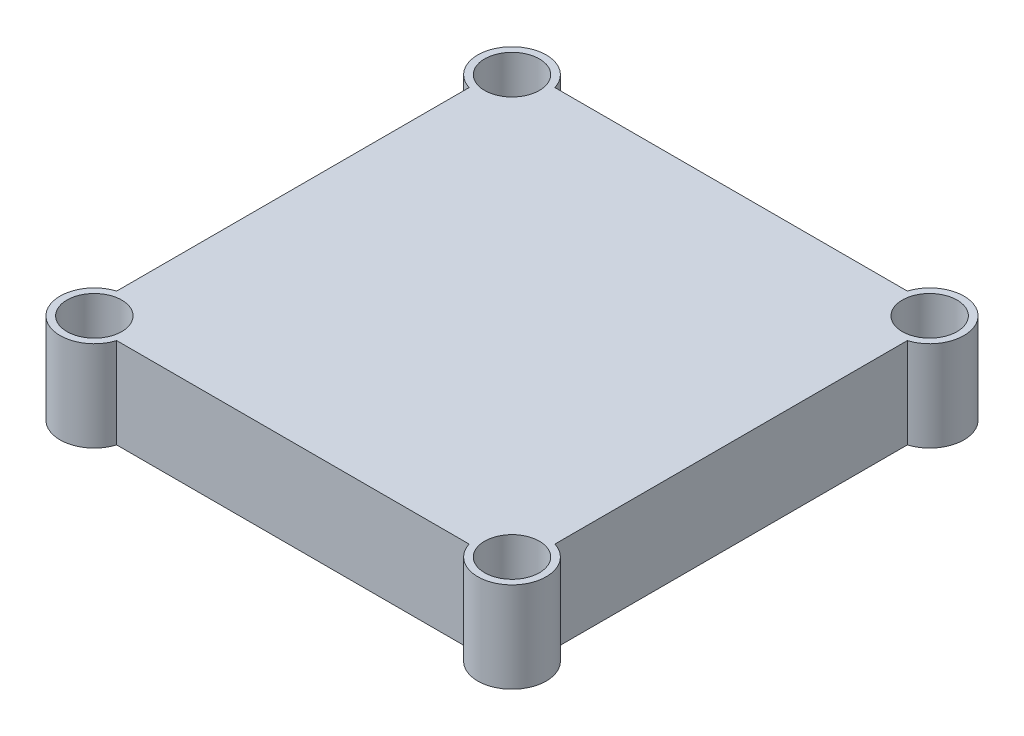
ISO-10303-21;
HEADER;
FILE_DESCRIPTION(('STEP AP214'),'2;1');
FILE_NAME('part.step','',(''),(''),'','','');
FILE_SCHEMA(('AUTOMOTIVE_DESIGN { 1 0 10303 214 1 1 1 1 }'));
ENDSEC;
DATA;
#1=APPLICATION_CONTEXT('core data for automotive mechanical design processes');
#2=APPLICATION_PROTOCOL_DEFINITION('international standard','automotive_design',2000,#1);
#3=PRODUCT_CONTEXT('',#1,'mechanical');
#4=PRODUCT('Part','Part','',(#3));
#5=PRODUCT_RELATED_PRODUCT_CATEGORY('part','',(#4));
#6=PRODUCT_DEFINITION_FORMATION('','',#4);
#7=PRODUCT_DEFINITION_CONTEXT('part definition',#1,'design');
#8=PRODUCT_DEFINITION('design','',#6,#7);
#9=PRODUCT_DEFINITION_SHAPE('','',#8);
#10=(LENGTH_UNIT() NAMED_UNIT(*) SI_UNIT(.MILLI.,.METRE.));
#11=(NAMED_UNIT(*) PLANE_ANGLE_UNIT() SI_UNIT($,.RADIAN.));
#12=(NAMED_UNIT(*) SI_UNIT($,.STERADIAN.) SOLID_ANGLE_UNIT());
#13=UNCERTAINTY_MEASURE_WITH_UNIT(LENGTH_MEASURE(1.E-05),#10,'distance_accuracy_value','');
#14=(GEOMETRIC_REPRESENTATION_CONTEXT(3) GLOBAL_UNCERTAINTY_ASSIGNED_CONTEXT((#13)) GLOBAL_UNIT_ASSIGNED_CONTEXT((#10,
#11,#12)) REPRESENTATION_CONTEXT('',''));
#15=CARTESIAN_POINT('',(0.,0.,0.));
#16=DIRECTION('',(0.,0.,1.));
#17=DIRECTION('',(1.,0.,0.));
#18=AXIS2_PLACEMENT_3D('',#15,#16,#17);
#19=CARTESIAN_POINT('',(16.,6.6,16.));
#20=DIRECTION('',(-1.,0.,0.));
#21=DIRECTION('',(0.,0.,1.));
#22=AXIS2_PLACEMENT_3D('',#19,#20,#21);
#23=PLANE('',#22);
#24=DIRECTION('',(0.,-1.,0.));
#25=VECTOR('',#24,1.);
#26=CARTESIAN_POINT('',(16.,6.6,-12.8651519964576));
#27=LINE('',#26,#25);
#28=CARTESIAN_POINT('',(16.,6.6,-12.8651519964576));
#29=VERTEX_POINT('',#28);
#30=CARTESIAN_POINT('',(16.,0.,-12.8651519964576));
#31=VERTEX_POINT('',#30);
#32=EDGE_CURVE('E122',#29,#31,#27,.T.);
#33=ORIENTED_EDGE('',*,*,#32,.F.);
#34=DIRECTION('',(0.,0.,-1.));
#35=VECTOR('',#34,1.);
#36=CARTESIAN_POINT('',(16.,6.6,16.));
#37=LINE('',#36,#35);
#38=CARTESIAN_POINT('',(16.,6.6,12.8651519964576));
#39=VERTEX_POINT('',#38);
#40=EDGE_CURVE('E209',#39,#29,#37,.T.);
#41=ORIENTED_EDGE('',*,*,#40,.F.);
#42=DIRECTION('',(0.,-1.,0.));
#43=VECTOR('',#42,1.);
#44=CARTESIAN_POINT('',(16.,6.6,12.8651519964576));
#45=LINE('',#44,#43);
#46=CARTESIAN_POINT('',(16.,0.,12.8651519964576));
#47=VERTEX_POINT('',#46);
#48=EDGE_CURVE('E134',#47,#39,#45,.F.);
#49=ORIENTED_EDGE('',*,*,#48,.F.);
#50=DIRECTION('',(0.,0.,-1.));
#51=VECTOR('',#50,1.);
#52=CARTESIAN_POINT('',(16.,0.,16.));
#53=LINE('',#52,#51);
#54=EDGE_CURVE('E216',#47,#31,#53,.T.);
#55=ORIENTED_EDGE('',*,*,#54,.T.);
#56=EDGE_LOOP('',(#33,#41,#49,#55));
#57=FACE_BOUND('',#56,.T.);
#58=ADVANCED_FACE('F104',(#57),#23,.F.);
#59=CARTESIAN_POINT('',(16.,6.6,-16.));
#60=DIRECTION('',(0.,0.,1.));
#61=DIRECTION('',(1.,0.,0.));
#62=AXIS2_PLACEMENT_3D('',#59,#60,#61);
#63=PLANE('',#62);
#64=DIRECTION('',(0.,-1.,0.));
#65=VECTOR('',#64,1.);
#66=CARTESIAN_POINT('',(-12.8651519964576,6.6,-16.));
#67=LINE('',#66,#65);
#68=CARTESIAN_POINT('',(-12.8651519964576,6.6,-16.));
#69=VERTEX_POINT('',#68);
#70=CARTESIAN_POINT('',(-12.8651519964576,0.,-16.));
#71=VERTEX_POINT('',#70);
#72=EDGE_CURVE('E12',#69,#71,#67,.T.);
#73=ORIENTED_EDGE('',*,*,#72,.F.);
#74=DIRECTION('',(-1.,0.,0.));
#75=VECTOR('',#74,1.);
#76=CARTESIAN_POINT('',(16.,6.6,-16.));
#77=LINE('',#76,#75);
#78=CARTESIAN_POINT('',(12.8651519964576,6.6,-16.));
#79=VERTEX_POINT('',#78);
#80=EDGE_CURVE('E180',#79,#69,#77,.T.);
#81=ORIENTED_EDGE('',*,*,#80,.F.);
#82=DIRECTION('',(0.,-1.,0.));
#83=VECTOR('',#82,1.);
#84=CARTESIAN_POINT('',(12.8651519964576,6.6,-16.));
#85=LINE('',#84,#83);
#86=CARTESIAN_POINT('',(12.8651519964576,0.,-16.));
#87=VERTEX_POINT('',#86);
#88=EDGE_CURVE('E113',#87,#79,#85,.F.);
#89=ORIENTED_EDGE('',*,*,#88,.F.);
#90=DIRECTION('',(-1.,0.,0.));
#91=VECTOR('',#90,1.);
#92=CARTESIAN_POINT('',(16.,0.,-16.));
#93=LINE('',#92,#91);
#94=EDGE_CURVE('E179',#87,#71,#93,.T.);
#95=ORIENTED_EDGE('',*,*,#94,.T.);
#96=EDGE_LOOP('',(#73,#81,#89,#95));
#97=FACE_BOUND('',#96,.T.);
#98=ADVANCED_FACE('F172',(#97),#63,.F.);
#99=CARTESIAN_POINT('',(-16.,6.6,16.));
#100=DIRECTION('',(-1.,0.,0.));
#101=DIRECTION('',(0.,0.,1.));
#102=AXIS2_PLACEMENT_3D('',#99,#100,#101);
#103=PLANE('',#102);
#104=DIRECTION('',(0.,0.,-1.));
#105=VECTOR('',#104,1.);
#106=CARTESIAN_POINT('',(-16.,0.,16.));
#107=LINE('',#106,#105);
#108=CARTESIAN_POINT('',(-16.,0.,12.8651519964576));
#109=VERTEX_POINT('',#108);
#110=CARTESIAN_POINT('',(-16.,0.,-12.8651519964576));
#111=VERTEX_POINT('',#110);
#112=EDGE_CURVE('E200',#109,#111,#107,.T.);
#113=ORIENTED_EDGE('',*,*,#112,.F.);
#114=DIRECTION('',(0.,-1.,0.));
#115=VECTOR('',#114,1.);
#116=CARTESIAN_POINT('',(-16.,6.6,12.8651519964576));
#117=LINE('',#116,#115);
#118=CARTESIAN_POINT('',(-16.,6.6,12.8651519964576));
#119=VERTEX_POINT('',#118);
#120=EDGE_CURVE('E108',#109,#119,#117,.F.);
#121=ORIENTED_EDGE('',*,*,#120,.T.);
#122=DIRECTION('',(0.,0.,-1.));
#123=VECTOR('',#122,1.);
#124=CARTESIAN_POINT('',(-16.,6.6,16.));
#125=LINE('',#124,#123);
#126=CARTESIAN_POINT('',(-16.,6.6,-12.8651519964576));
#127=VERTEX_POINT('',#126);
#128=EDGE_CURVE('E262',#119,#127,#125,.T.);
#129=ORIENTED_EDGE('',*,*,#128,.T.);
#130=DIRECTION('',(0.,-1.,0.));
#131=VECTOR('',#130,1.);
#132=CARTESIAN_POINT('',(-16.,6.6,-12.8651519964576));
#133=LINE('',#132,#131);
#134=EDGE_CURVE('E243',#127,#111,#133,.T.);
#135=ORIENTED_EDGE('',*,*,#134,.T.);
#136=EDGE_LOOP('',(#113,#121,#129,#135));
#137=FACE_BOUND('',#136,.T.);
#138=ADVANCED_FACE('F332',(#137),#103,.T.);
#139=CARTESIAN_POINT('',(16.,6.6,16.));
#140=DIRECTION('',(0.,0.,1.));
#141=DIRECTION('',(1.,0.,0.));
#142=AXIS2_PLACEMENT_3D('',#139,#140,#141);
#143=PLANE('',#142);
#144=DIRECTION('',(-1.,0.,0.));
#145=VECTOR('',#144,1.);
#146=CARTESIAN_POINT('',(16.,6.6,16.));
#147=LINE('',#146,#145);
#148=CARTESIAN_POINT('',(12.8651519964576,6.6,16.));
#149=VERTEX_POINT('',#148);
#150=CARTESIAN_POINT('',(-12.8651519964576,6.6,16.));
#151=VERTEX_POINT('',#150);
#152=EDGE_CURVE('E252',#149,#151,#147,.T.);
#153=ORIENTED_EDGE('',*,*,#152,.T.);
#154=DIRECTION('',(0.,-1.,0.));
#155=VECTOR('',#154,1.);
#156=CARTESIAN_POINT('',(-12.8651519964576,6.6,16.));
#157=LINE('',#156,#155);
#158=CARTESIAN_POINT('',(-12.8651519964576,0.,16.));
#159=VERTEX_POINT('',#158);
#160=EDGE_CURVE('E244',#151,#159,#157,.T.);
#161=ORIENTED_EDGE('',*,*,#160,.T.);
#162=DIRECTION('',(-1.,0.,0.));
#163=VECTOR('',#162,1.);
#164=CARTESIAN_POINT('',(16.,0.,16.));
#165=LINE('',#164,#163);
#166=CARTESIAN_POINT('',(12.8651519964576,0.,16.));
#167=VERTEX_POINT('',#166);
#168=EDGE_CURVE('E204',#167,#159,#165,.T.);
#169=ORIENTED_EDGE('',*,*,#168,.F.);
#170=DIRECTION('',(0.,-1.,0.));
#171=VECTOR('',#170,1.);
#172=CARTESIAN_POINT('',(12.8651519964576,6.6,16.));
#173=LINE('',#172,#171);
#174=EDGE_CURVE('E236',#167,#149,#173,.F.);
#175=ORIENTED_EDGE('',*,*,#174,.T.);
#176=EDGE_LOOP('',(#153,#161,#169,#175));
#177=FACE_BOUND('',#176,.T.);
#178=ADVANCED_FACE('F246',(#177),#143,.T.);
#179=CARTESIAN_POINT('',(0.,0.,0.));
#180=DIRECTION('',(0.,-1.,0.));
#181=DIRECTION('',(0.,0.,-1.));
#182=AXIS2_PLACEMENT_3D('',#179,#180,#181);
#183=PLANE('',#182);
#184=CARTESIAN_POINT('',(-15.25,0.,15.25));
#185=DIRECTION('',(0.,-1.,0.));
#186=DIRECTION('',(0.,0.,-1.));
#187=AXIS2_PLACEMENT_3D('',#184,#185,#186);
#188=CIRCLE('',#187,2.);
#189=CARTESIAN_POINT('',(-15.25,0.,13.25));
#190=VERTEX_POINT('',#189);
#191=EDGE_CURVE('E231',#190,#190,#188,.T.);
#192=ORIENTED_EDGE('',*,*,#191,.F.);
#193=EDGE_LOOP('',(#192));
#194=FACE_BOUND('',#193,.T.);
#195=CARTESIAN_POINT('',(15.25,0.,15.25));
#196=DIRECTION('',(0.,-1.,0.));
#197=DIRECTION('',(0.,0.,-1.));
#198=AXIS2_PLACEMENT_3D('',#195,#196,#197);
#199=CIRCLE('',#198,2.);
#200=CARTESIAN_POINT('',(15.25,0.,13.25));
#201=VERTEX_POINT('',#200);
#202=EDGE_CURVE('E274',#201,#201,#199,.T.);
#203=ORIENTED_EDGE('',*,*,#202,.F.);
#204=EDGE_LOOP('',(#203));
#205=FACE_BOUND('',#204,.T.);
#206=CARTESIAN_POINT('',(15.25,0.,-15.25));
#207=DIRECTION('',(0.,-1.,0.));
#208=DIRECTION('',(0.,0.,-1.));
#209=AXIS2_PLACEMENT_3D('',#206,#207,#208);
#210=CIRCLE('',#209,2.);
#211=CARTESIAN_POINT('',(15.25,0.,-17.25));
#212=VERTEX_POINT('',#211);
#213=EDGE_CURVE('E276',#212,#212,#210,.T.);
#214=ORIENTED_EDGE('',*,*,#213,.F.);
#215=EDGE_LOOP('',(#214));
#216=FACE_BOUND('',#215,.T.);
#217=CARTESIAN_POINT('',(-15.25,0.,-15.25));
#218=DIRECTION('',(0.,-1.,0.));
#219=DIRECTION('',(0.,0.,-1.));
#220=AXIS2_PLACEMENT_3D('',#217,#218,#219);
#221=CIRCLE('',#220,2.);
#222=CARTESIAN_POINT('',(-15.25,0.,-17.25));
#223=VERTEX_POINT('',#222);
#224=EDGE_CURVE('E285',#223,#223,#221,.T.);
#225=ORIENTED_EDGE('',*,*,#224,.F.);
#226=EDGE_LOOP('',(#225));
#227=FACE_BOUND('',#226,.T.);
#228=ORIENTED_EDGE('',*,*,#94,.F.);
#229=CARTESIAN_POINT('',(15.25,0.,-15.25));
#230=DIRECTION('',(0.,1.,0.));
#231=DIRECTION('',(0.,0.,1.));
#232=AXIS2_PLACEMENT_3D('',#229,#230,#231);
#233=CIRCLE('',#232,2.5);
#234=EDGE_CURVE('E183',#31,#87,#233,.T.);
#235=ORIENTED_EDGE('',*,*,#234,.F.);
#236=ORIENTED_EDGE('',*,*,#54,.F.);
#237=CARTESIAN_POINT('',(15.25,0.,15.25));
#238=DIRECTION('',(0.,1.,0.));
#239=DIRECTION('',(0.,0.,1.));
#240=AXIS2_PLACEMENT_3D('',#237,#238,#239);
#241=CIRCLE('',#240,2.5);
#242=EDGE_CURVE('E234',#167,#47,#241,.T.);
#243=ORIENTED_EDGE('',*,*,#242,.F.);
#244=ORIENTED_EDGE('',*,*,#168,.T.);
#245=CARTESIAN_POINT('',(-15.25,0.,15.25));
#246=DIRECTION('',(0.,1.,0.));
#247=DIRECTION('',(0.,0.,1.));
#248=AXIS2_PLACEMENT_3D('',#245,#246,#247);
#249=CIRCLE('',#248,2.5);
#250=EDGE_CURVE('E210',#109,#159,#249,.T.);
#251=ORIENTED_EDGE('',*,*,#250,.F.);
#252=ORIENTED_EDGE('',*,*,#112,.T.);
#253=CARTESIAN_POINT('',(-15.25,0.,-15.25));
#254=DIRECTION('',(0.,1.,0.));
#255=DIRECTION('',(0.,0.,1.));
#256=AXIS2_PLACEMENT_3D('',#253,#254,#255);
#257=CIRCLE('',#256,2.5);
#258=EDGE_CURVE('E197',#71,#111,#257,.T.);
#259=ORIENTED_EDGE('',*,*,#258,.F.);
#260=EDGE_LOOP('',(#228,#235,#236,#243,#244,#251,#252,#259));
#261=FACE_BOUND('',#260,.T.);
#262=ADVANCED_FACE('F195',(#194,#205,#216,#227,#261),#183,.T.);
#263=CARTESIAN_POINT('',(0.,6.6,0.));
#264=DIRECTION('',(0.,-1.,0.));
#265=DIRECTION('',(0.,0.,-1.));
#266=AXIS2_PLACEMENT_3D('',#263,#264,#265);
#267=PLANE('',#266);
#268=CARTESIAN_POINT('',(-15.25,6.6,15.25));
#269=DIRECTION('',(0.,1.,0.));
#270=DIRECTION('',(0.,0.,1.));
#271=AXIS2_PLACEMENT_3D('',#268,#269,#270);
#272=CIRCLE('',#271,2.);
#273=CARTESIAN_POINT('',(-15.25,6.6,17.25));
#274=VERTEX_POINT('',#273);
#275=EDGE_CURVE('E295',#274,#274,#272,.T.);
#276=ORIENTED_EDGE('',*,*,#275,.F.);
#277=EDGE_LOOP('',(#276));
#278=FACE_BOUND('',#277,.T.);
#279=CARTESIAN_POINT('',(15.25,6.6,15.25));
#280=DIRECTION('',(0.,1.,0.));
#281=DIRECTION('',(0.,0.,1.));
#282=AXIS2_PLACEMENT_3D('',#279,#280,#281);
#283=CIRCLE('',#282,2.);
#284=CARTESIAN_POINT('',(15.25,6.6,17.25));
#285=VERTEX_POINT('',#284);
#286=EDGE_CURVE('E299',#285,#285,#283,.T.);
#287=ORIENTED_EDGE('',*,*,#286,.F.);
#288=EDGE_LOOP('',(#287));
#289=FACE_BOUND('',#288,.T.);
#290=CARTESIAN_POINT('',(15.25,6.6,-15.25));
#291=DIRECTION('',(0.,1.,0.));
#292=DIRECTION('',(0.,0.,1.));
#293=AXIS2_PLACEMENT_3D('',#290,#291,#292);
#294=CIRCLE('',#293,2.);
#295=CARTESIAN_POINT('',(15.25,6.6,-13.25));
#296=VERTEX_POINT('',#295);
#297=EDGE_CURVE('E292',#296,#296,#294,.T.);
#298=ORIENTED_EDGE('',*,*,#297,.F.);
#299=EDGE_LOOP('',(#298));
#300=FACE_BOUND('',#299,.T.);
#301=CARTESIAN_POINT('',(-15.25,6.6,-15.25));
#302=DIRECTION('',(0.,1.,0.));
#303=DIRECTION('',(0.,0.,1.));
#304=AXIS2_PLACEMENT_3D('',#301,#302,#303);
#305=CIRCLE('',#304,2.);
#306=CARTESIAN_POINT('',(-15.25,6.6,-13.25));
#307=VERTEX_POINT('',#306);
#308=EDGE_CURVE('E289',#307,#307,#305,.T.);
#309=ORIENTED_EDGE('',*,*,#308,.F.);
#310=EDGE_LOOP('',(#309));
#311=FACE_BOUND('',#310,.T.);
#312=CARTESIAN_POINT('',(15.25,6.6,-15.25));
#313=DIRECTION('',(0.,1.,0.));
#314=DIRECTION('',(0.,0.,1.));
#315=AXIS2_PLACEMENT_3D('',#312,#313,#314);
#316=CIRCLE('',#315,2.5);
#317=EDGE_CURVE('E187',#29,#79,#316,.T.);
#318=ORIENTED_EDGE('',*,*,#317,.T.);
#319=ORIENTED_EDGE('',*,*,#80,.T.);
#320=CARTESIAN_POINT('',(-15.25,6.6,-15.25));
#321=DIRECTION('',(0.,1.,0.));
#322=DIRECTION('',(0.,0.,1.));
#323=AXIS2_PLACEMENT_3D('',#320,#321,#322);
#324=CIRCLE('',#323,2.5);
#325=EDGE_CURVE('E225',#69,#127,#324,.T.);
#326=ORIENTED_EDGE('',*,*,#325,.T.);
#327=ORIENTED_EDGE('',*,*,#128,.F.);
#328=CARTESIAN_POINT('',(-15.25,6.6,15.25));
#329=DIRECTION('',(0.,1.,0.));
#330=DIRECTION('',(0.,0.,1.));
#331=AXIS2_PLACEMENT_3D('',#328,#329,#330);
#332=CIRCLE('',#331,2.5);
#333=EDGE_CURVE('E199',#119,#151,#332,.T.);
#334=ORIENTED_EDGE('',*,*,#333,.T.);
#335=ORIENTED_EDGE('',*,*,#152,.F.);
#336=CARTESIAN_POINT('',(15.25,6.6,15.25));
#337=DIRECTION('',(0.,1.,0.));
#338=DIRECTION('',(0.,0.,1.));
#339=AXIS2_PLACEMENT_3D('',#336,#337,#338);
#340=CIRCLE('',#339,2.5);
#341=EDGE_CURVE('E193',#149,#39,#340,.T.);
#342=ORIENTED_EDGE('',*,*,#341,.T.);
#343=ORIENTED_EDGE('',*,*,#40,.T.);
#344=EDGE_LOOP('',(#318,#319,#326,#327,#334,#335,#342,#343));
#345=FACE_BOUND('',#344,.T.);
#346=ADVANCED_FACE('F261',(#278,#289,#300,#311,#345),#267,.F.);
#347=CARTESIAN_POINT('',(-15.25,6.6,-15.25));
#348=DIRECTION('',(0.,-1.,0.));
#349=DIRECTION('',(0.,0.,-1.));
#350=AXIS2_PLACEMENT_3D('',#347,#348,#349);
#351=CYLINDRICAL_SURFACE('',#350,2.5);
#352=ORIENTED_EDGE('',*,*,#325,.F.);
#353=ORIENTED_EDGE('',*,*,#72,.T.);
#354=ORIENTED_EDGE('',*,*,#258,.T.);
#355=ORIENTED_EDGE('',*,*,#134,.F.);
#356=EDGE_LOOP('',(#352,#353,#354,#355));
#357=FACE_BOUND('',#356,.T.);
#358=ADVANCED_FACE('F306',(#357),#351,.T.);
#359=CARTESIAN_POINT('',(15.25,6.6,-15.25));
#360=DIRECTION('',(0.,-1.,0.));
#361=DIRECTION('',(0.,0.,-1.));
#362=AXIS2_PLACEMENT_3D('',#359,#360,#361);
#363=CYLINDRICAL_SURFACE('',#362,2.5);
#364=ORIENTED_EDGE('',*,*,#234,.T.);
#365=ORIENTED_EDGE('',*,*,#88,.T.);
#366=ORIENTED_EDGE('',*,*,#317,.F.);
#367=ORIENTED_EDGE('',*,*,#32,.T.);
#368=EDGE_LOOP('',(#364,#365,#366,#367));
#369=FACE_BOUND('',#368,.T.);
#370=ADVANCED_FACE('F189',(#369),#363,.T.);
#371=CARTESIAN_POINT('',(15.25,6.6,15.25));
#372=DIRECTION('',(0.,-1.,0.));
#373=DIRECTION('',(0.,0.,-1.));
#374=AXIS2_PLACEMENT_3D('',#371,#372,#373);
#375=CYLINDRICAL_SURFACE('',#374,2.5);
#376=ORIENTED_EDGE('',*,*,#174,.F.);
#377=ORIENTED_EDGE('',*,*,#242,.T.);
#378=ORIENTED_EDGE('',*,*,#48,.T.);
#379=ORIENTED_EDGE('',*,*,#341,.F.);
#380=EDGE_LOOP('',(#376,#377,#378,#379));
#381=FACE_BOUND('',#380,.T.);
#382=ADVANCED_FACE('F110',(#381),#375,.T.);
#383=CARTESIAN_POINT('',(-15.25,6.6,15.25));
#384=DIRECTION('',(0.,-1.,0.));
#385=DIRECTION('',(0.,0.,-1.));
#386=AXIS2_PLACEMENT_3D('',#383,#384,#385);
#387=CYLINDRICAL_SURFACE('',#386,2.5);
#388=ORIENTED_EDGE('',*,*,#120,.F.);
#389=ORIENTED_EDGE('',*,*,#250,.T.);
#390=ORIENTED_EDGE('',*,*,#160,.F.);
#391=ORIENTED_EDGE('',*,*,#333,.F.);
#392=EDGE_LOOP('',(#388,#389,#390,#391));
#393=FACE_BOUND('',#392,.T.);
#394=ADVANCED_FACE('F258',(#393),#387,.T.);
#395=CARTESIAN_POINT('',(-15.25,-3.4,-15.25));
#396=DIRECTION('',(0.,1.,0.));
#397=DIRECTION('',(0.,0.,1.));
#398=AXIS2_PLACEMENT_3D('',#395,#396,#397);
#399=CYLINDRICAL_SURFACE('',#398,2.);
#400=ORIENTED_EDGE('',*,*,#224,.T.);
#401=EDGE_LOOP('',(#400));
#402=FACE_BOUND('',#401,.T.);
#403=ORIENTED_EDGE('',*,*,#308,.T.);
#404=EDGE_LOOP('',(#403));
#405=FACE_BOUND('',#404,.T.);
#406=ADVANCED_FACE('F311',(#402,#405),#399,.F.);
#407=CARTESIAN_POINT('',(15.25,-3.4,-15.25));
#408=DIRECTION('',(0.,1.,0.));
#409=DIRECTION('',(0.,0.,1.));
#410=AXIS2_PLACEMENT_3D('',#407,#408,#409);
#411=CYLINDRICAL_SURFACE('',#410,2.);
#412=ORIENTED_EDGE('',*,*,#213,.T.);
#413=EDGE_LOOP('',(#412));
#414=FACE_BOUND('',#413,.T.);
#415=ORIENTED_EDGE('',*,*,#297,.T.);
#416=EDGE_LOOP('',(#415));
#417=FACE_BOUND('',#416,.T.);
#418=ADVANCED_FACE('F305',(#414,#417),#411,.F.);
#419=CARTESIAN_POINT('',(15.25,-3.4,15.25));
#420=DIRECTION('',(0.,1.,0.));
#421=DIRECTION('',(0.,0.,1.));
#422=AXIS2_PLACEMENT_3D('',#419,#420,#421);
#423=CYLINDRICAL_SURFACE('',#422,2.);
#424=ORIENTED_EDGE('',*,*,#202,.T.);
#425=EDGE_LOOP('',(#424));
#426=FACE_BOUND('',#425,.T.);
#427=ORIENTED_EDGE('',*,*,#286,.T.);
#428=EDGE_LOOP('',(#427));
#429=FACE_BOUND('',#428,.T.);
#430=ADVANCED_FACE('F319',(#426,#429),#423,.F.);
#431=CARTESIAN_POINT('',(-15.25,-3.4,15.25));
#432=DIRECTION('',(0.,1.,0.));
#433=DIRECTION('',(0.,0.,1.));
#434=AXIS2_PLACEMENT_3D('',#431,#432,#433);
#435=CYLINDRICAL_SURFACE('',#434,2.);
#436=ORIENTED_EDGE('',*,*,#191,.T.);
#437=EDGE_LOOP('',(#436));
#438=FACE_BOUND('',#437,.T.);
#439=ORIENTED_EDGE('',*,*,#275,.T.);
#440=EDGE_LOOP('',(#439));
#441=FACE_BOUND('',#440,.T.);
#442=ADVANCED_FACE('F398',(#438,#441),#435,.F.);
#443=CLOSED_SHELL('',(#58,#98,#138,#178,#262,#346,#358,#370,#382,#394,#406,#418,#430,#442));
#444=MANIFOLD_SOLID_BREP('B2',#443);
#445=ADVANCED_BREP_SHAPE_REPRESENTATION('',(#18,#444),#14);
#446=SHAPE_DEFINITION_REPRESENTATION(#9,#445);
ENDSEC;
END-ISO-10303-21;
